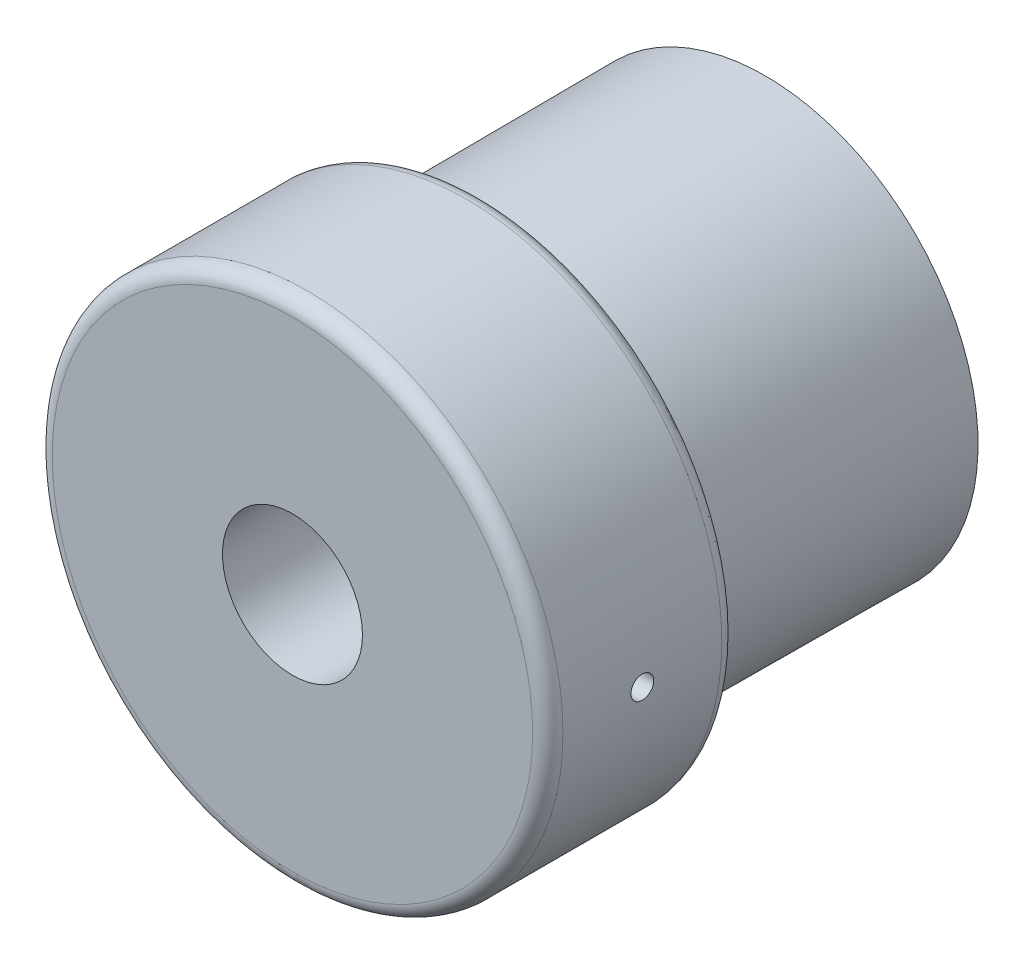
ISO-10303-21;
HEADER;
FILE_DESCRIPTION(('STEP AP214'),'2;1');
FILE_NAME('part.step','',(''),(''),'','','');
FILE_SCHEMA(('AUTOMOTIVE_DESIGN { 1 0 10303 214 1 1 1 1 }'));
ENDSEC;
DATA;
#1=APPLICATION_CONTEXT('core data for automotive mechanical design processes');
#2=APPLICATION_PROTOCOL_DEFINITION('international standard','automotive_design',2000,#1);
#3=PRODUCT_CONTEXT('',#1,'mechanical');
#4=PRODUCT('Part','Part','',(#3));
#5=PRODUCT_RELATED_PRODUCT_CATEGORY('part','',(#4));
#6=PRODUCT_DEFINITION_FORMATION('','',#4);
#7=PRODUCT_DEFINITION_CONTEXT('part definition',#1,'design');
#8=PRODUCT_DEFINITION('design','',#6,#7);
#9=PRODUCT_DEFINITION_SHAPE('','',#8);
#10=(LENGTH_UNIT() NAMED_UNIT(*) SI_UNIT(.MILLI.,.METRE.));
#11=(NAMED_UNIT(*) PLANE_ANGLE_UNIT() SI_UNIT($,.RADIAN.));
#12=(NAMED_UNIT(*) SI_UNIT($,.STERADIAN.) SOLID_ANGLE_UNIT());
#13=UNCERTAINTY_MEASURE_WITH_UNIT(LENGTH_MEASURE(1.E-05),#10,'distance_accuracy_value','');
#14=(GEOMETRIC_REPRESENTATION_CONTEXT(3) GLOBAL_UNCERTAINTY_ASSIGNED_CONTEXT((#13)) GLOBAL_UNIT_ASSIGNED_CONTEXT((#10,
#11,#12)) REPRESENTATION_CONTEXT('',''));
#15=CARTESIAN_POINT('',(0.,0.,0.));
#16=DIRECTION('',(0.,0.,1.));
#17=DIRECTION('',(1.,0.,0.));
#18=AXIS2_PLACEMENT_3D('',#15,#16,#17);
#19=CARTESIAN_POINT('',(0.,0.,-1.));
#20=DIRECTION('',(0.,0.,1.));
#21=DIRECTION('',(1.,0.,0.));
#22=AXIS2_PLACEMENT_3D('',#19,#20,#21);
#23=CYLINDRICAL_SURFACE('',#22,3.7);
#24=CARTESIAN_POINT('',(0.,0.,9.76));
#25=DIRECTION('',(0.,0.,1.));
#26=DIRECTION('',(1.,0.,0.));
#27=AXIS2_PLACEMENT_3D('',#24,#25,#26);
#28=CIRCLE('',#27,3.7);
#29=CARTESIAN_POINT('',(3.7,0.,9.76));
#30=VERTEX_POINT('',#29);
#31=EDGE_CURVE('E117',#30,#30,#28,.T.);
#32=ORIENTED_EDGE('',*,*,#31,.T.);
#33=EDGE_LOOP('',(#32));
#34=FACE_BOUND('',#33,.T.);
#35=CARTESIAN_POINT('',(0.,0.,4.24));
#36=DIRECTION('',(0.,0.,1.));
#37=DIRECTION('',(1.,0.,0.));
#38=AXIS2_PLACEMENT_3D('',#35,#36,#37);
#39=CIRCLE('',#38,3.7);
#40=CARTESIAN_POINT('',(3.7,0.,4.24));
#41=VERTEX_POINT('',#40);
#42=EDGE_CURVE('E20',#41,#41,#39,.F.);
#43=ORIENTED_EDGE('',*,*,#42,.T.);
#44=EDGE_LOOP('',(#43));
#45=FACE_BOUND('',#44,.T.);
#46=ADVANCED_FACE('F17',(#34,#45),#23,.F.);
#47=CARTESIAN_POINT('',(0.,0.,4.));
#48=DIRECTION('',(0.,0.,1.));
#49=DIRECTION('',(1.,0.,0.));
#50=AXIS2_PLACEMENT_3D('',#47,#48,#49);
#51=TOROIDAL_SURFACE('',#50,3.88,0.3);
#52=ORIENTED_EDGE('',*,*,#42,.F.);
#53=EDGE_LOOP('',(#52));
#54=FACE_BOUND('',#53,.T.);
#55=CARTESIAN_POINT('',(0.,0.,3.76));
#56=DIRECTION('',(0.,0.,1.));
#57=DIRECTION('',(1.,0.,0.));
#58=AXIS2_PLACEMENT_3D('',#55,#56,#57);
#59=CIRCLE('',#58,3.7);
#60=CARTESIAN_POINT('',(3.7,0.,3.76));
#61=VERTEX_POINT('',#60);
#62=EDGE_CURVE('E111',#61,#61,#59,.F.);
#63=ORIENTED_EDGE('',*,*,#62,.T.);
#64=EDGE_LOOP('',(#63));
#65=FACE_BOUND('',#64,.T.);
#66=ADVANCED_FACE('F132',(#54,#65),#51,.F.);
#67=CARTESIAN_POINT('',(0.,0.,10.));
#68=DIRECTION('',(0.,0.,1.));
#69=DIRECTION('',(1.,0.,0.));
#70=AXIS2_PLACEMENT_3D('',#67,#68,#69);
#71=TOROIDAL_SURFACE('',#70,3.88,0.3);
#72=ORIENTED_EDGE('',*,*,#31,.F.);
#73=EDGE_LOOP('',(#72));
#74=FACE_BOUND('',#73,.T.);
#75=CARTESIAN_POINT('',(0.,0.,10.24));
#76=DIRECTION('',(0.,0.,1.));
#77=DIRECTION('',(1.,0.,0.));
#78=AXIS2_PLACEMENT_3D('',#75,#76,#77);
#79=CIRCLE('',#78,3.7);
#80=CARTESIAN_POINT('',(3.7,0.,10.24));
#81=VERTEX_POINT('',#80);
#82=EDGE_CURVE('E86',#81,#81,#79,.T.);
#83=ORIENTED_EDGE('',*,*,#82,.T.);
#84=EDGE_LOOP('',(#83));
#85=FACE_BOUND('',#84,.T.);
#86=ADVANCED_FACE('F137',(#74,#85),#71,.F.);
#87=CARTESIAN_POINT('',(0.,0.,-1.));
#88=DIRECTION('',(0.,0.,1.));
#89=DIRECTION('',(1.,0.,0.));
#90=AXIS2_PLACEMENT_3D('',#87,#88,#89);
#91=CYLINDRICAL_SURFACE('',#90,3.7);
#92=CARTESIAN_POINT('',(0.,0.,0.));
#93=DIRECTION('',(0.,0.,1.));
#94=DIRECTION('',(1.,0.,0.));
#95=AXIS2_PLACEMENT_3D('',#92,#93,#94);
#96=CIRCLE('',#95,3.7);
#97=CARTESIAN_POINT('',(3.7,0.,0.));
#98=VERTEX_POINT('',#97);
#99=EDGE_CURVE('E110',#98,#98,#96,.F.);
#100=ORIENTED_EDGE('',*,*,#99,.T.);
#101=EDGE_LOOP('',(#100));
#102=FACE_BOUND('',#101,.T.);
#103=ORIENTED_EDGE('',*,*,#62,.F.);
#104=EDGE_LOOP('',(#103));
#105=FACE_BOUND('',#104,.T.);
#106=ADVANCED_FACE('F136',(#102,#105),#91,.F.);
#107=CARTESIAN_POINT('',(-1.7,-6.3,-0.2));
#108=DIRECTION('',(0.,1.,0.));
#109=DIRECTION('',(1.,0.,0.));
#110=AXIS2_PLACEMENT_3D('',#107,#108,#109);
#111=PLANE('',#110);
#112=DIRECTION('',(0.,0.,1.));
#113=VECTOR('',#112,1.);
#114=CARTESIAN_POINT('',(-1.7,-6.3,-0.2));
#115=LINE('',#114,#113);
#116=CARTESIAN_POINT('',(-1.7,-6.3,0.));
#117=VERTEX_POINT('',#116);
#118=CARTESIAN_POINT('',(-1.7,-6.3,15.3));
#119=VERTEX_POINT('',#118);
#120=EDGE_CURVE('E297',#117,#119,#115,.T.);
#121=ORIENTED_EDGE('',*,*,#120,.F.);
#122=DIRECTION('',(1.,0.,0.));
#123=VECTOR('',#122,1.);
#124=CARTESIAN_POINT('',(-1.7,-6.3,0.));
#125=LINE('',#124,#123);
#126=CARTESIAN_POINT('',(1.7,-6.3,0.));
#127=VERTEX_POINT('',#126);
#128=EDGE_CURVE('E80',#117,#127,#125,.T.);
#129=ORIENTED_EDGE('',*,*,#128,.T.);
#130=DIRECTION('',(0.,0.,-1.));
#131=VECTOR('',#130,1.);
#132=CARTESIAN_POINT('',(1.7,-6.3,-0.2));
#133=LINE('',#132,#131);
#134=CARTESIAN_POINT('',(1.7,-6.3,15.3));
#135=VERTEX_POINT('',#134);
#136=EDGE_CURVE('E101',#127,#135,#133,.F.);
#137=ORIENTED_EDGE('',*,*,#136,.T.);
#138=DIRECTION('',(1.,0.,0.));
#139=VECTOR('',#138,1.);
#140=CARTESIAN_POINT('',(-1.7,-6.3,15.3));
#141=LINE('',#140,#139);
#142=EDGE_CURVE('E278',#135,#119,#141,.F.);
#143=ORIENTED_EDGE('',*,*,#142,.T.);
#144=EDGE_LOOP('',(#121,#129,#137,#143));
#145=FACE_BOUND('',#144,.T.);
#146=ADVANCED_FACE('F143',(#145),#111,.F.);
#147=CARTESIAN_POINT('',(0.,0.,-1.));
#148=DIRECTION('',(0.,0.,1.));
#149=DIRECTION('',(1.,0.,0.));
#150=AXIS2_PLACEMENT_3D('',#147,#148,#149);
#151=CYLINDRICAL_SURFACE('',#150,3.7);
#152=ORIENTED_EDGE('',*,*,#82,.F.);
#153=EDGE_LOOP('',(#152));
#154=FACE_BOUND('',#153,.T.);
#155=CARTESIAN_POINT('',(0.,0.,17.76));
#156=DIRECTION('',(0.,0.,1.));
#157=DIRECTION('',(1.,0.,0.));
#158=AXIS2_PLACEMENT_3D('',#155,#156,#157);
#159=CIRCLE('',#158,3.7);
#160=CARTESIAN_POINT('',(3.7,0.,17.76));
#161=VERTEX_POINT('',#160);
#162=EDGE_CURVE('E262',#161,#161,#159,.T.);
#163=ORIENTED_EDGE('',*,*,#162,.T.);
#164=EDGE_LOOP('',(#163));
#165=FACE_BOUND('',#164,.T.);
#166=ADVANCED_FACE('F149',(#154,#165),#151,.F.);
#167=CARTESIAN_POINT('',(1.7,-11.6,-0.2));
#168=DIRECTION('',(1.,0.,0.));
#169=DIRECTION('',(0.,1.,0.));
#170=AXIS2_PLACEMENT_3D('',#167,#168,#169);
#171=PLANE('',#170);
#172=ORIENTED_EDGE('',*,*,#136,.F.);
#173=DIRECTION('',(0.,1.,0.));
#174=VECTOR('',#173,1.);
#175=CARTESIAN_POINT('',(1.7,-11.6,0.));
#176=LINE('',#175,#174);
#177=CARTESIAN_POINT('',(1.7,-11.1208138191411,0.));
#178=VERTEX_POINT('',#177);
#179=EDGE_CURVE('E310',#127,#178,#176,.F.);
#180=ORIENTED_EDGE('',*,*,#179,.T.);
#181=CARTESIAN_POINT('',(1.7,-11.0499954751122,15.));
#182=CARTESIAN_POINT('',(1.7,-11.0617993987189,12.5000000041214));
#183=CARTESIAN_POINT('',(1.7,-11.0736028891913,10.0000000061978));
#184=CARTESIAN_POINT('',(1.7,-11.0972090038673,5.00000000626089));
#185=CARTESIAN_POINT('',(1.7,-11.109011628071,2.50000000424749));
#186=CARTESIAN_POINT('',(1.7,-11.1208138191402,1.89174994022195E-10));
#187=B_SPLINE_CURVE_WITH_KNOTS('',3,(#181,#182,#183,#184,#185,#186),.UNSPECIFIED.,.F.,.F.,(4,2,
4),(0.,7.50008358673726,15.0001671734745),.UNSPECIFIED.);
#188=CARTESIAN_POINT('',(1.7,-11.0499954751122,15.));
#189=VERTEX_POINT('',#188);
#190=EDGE_CURVE('E98',#189,#178,#187,.T.);
#191=ORIENTED_EDGE('',*,*,#190,.F.);
#192=DIRECTION('',(0.,1.,0.));
#193=VECTOR('',#192,1.);
#194=CARTESIAN_POINT('',(1.7,0.,15.));
#195=LINE('',#194,#193);
#196=CARTESIAN_POINT('',(1.7,-11.6,15.));
#197=VERTEX_POINT('',#196);
#198=EDGE_CURVE('E38',#197,#189,#195,.T.);
#199=ORIENTED_EDGE('',*,*,#198,.F.);
#200=DIRECTION('',(0.,0.,-1.));
#201=VECTOR('',#200,1.);
#202=CARTESIAN_POINT('',(1.7,-11.6,-0.2));
#203=LINE('',#202,#201);
#204=CARTESIAN_POINT('',(1.7,-11.6,15.3));
#205=VERTEX_POINT('',#204);
#206=EDGE_CURVE('E49',#205,#197,#203,.T.);
#207=ORIENTED_EDGE('',*,*,#206,.F.);
#208=DIRECTION('',(0.,1.,0.));
#209=VECTOR('',#208,1.);
#210=CARTESIAN_POINT('',(1.7,-11.6,15.3));
#211=LINE('',#210,#209);
#212=EDGE_CURVE('E287',#205,#135,#211,.T.);
#213=ORIENTED_EDGE('',*,*,#212,.T.);
#214=EDGE_LOOP('',(#172,#180,#191,#199,#207,#213));
#215=FACE_BOUND('',#214,.T.);
#216=ADVANCED_FACE('F96',(#215),#171,.F.);
#217=CARTESIAN_POINT('',(0.,0.,0.));
#218=DIRECTION('',(0.,0.,1.));
#219=DIRECTION('',(1.,0.,0.));
#220=AXIS2_PLACEMENT_3D('',#217,#218,#219);
#221=PLANE('',#220);
#222=ORIENTED_EDGE('',*,*,#128,.F.);
#223=DIRECTION('',(0.,1.,0.));
#224=VECTOR('',#223,1.);
#225=CARTESIAN_POINT('',(-1.7,-11.6,0.));
#226=LINE('',#225,#224);
#227=CARTESIAN_POINT('',(-1.7,-11.1208138191407,9.45874792816306E-11));
#228=VERTEX_POINT('',#227);
#229=EDGE_CURVE('E61',#228,#117,#226,.T.);
#230=ORIENTED_EDGE('',*,*,#229,.F.);
#231=CARTESIAN_POINT('',(0.,0.,0.));
#232=DIRECTION('',(0.,0.,-1.));
#233=DIRECTION('',(-1.,0.,0.));
#234=AXIS2_PLACEMENT_3D('',#231,#232,#233);
#235=CIRCLE('',#234,11.25);
#236=EDGE_CURVE('E263',#178,#228,#235,.F.);
#237=ORIENTED_EDGE('',*,*,#236,.F.);
#238=ORIENTED_EDGE('',*,*,#179,.F.);
#239=EDGE_LOOP('',(#222,#230,#237,#238));
#240=FACE_BOUND('',#239,.T.);
#241=ORIENTED_EDGE('',*,*,#99,.F.);
#242=EDGE_LOOP('',(#241));
#243=FACE_BOUND('',#242,.T.);
#244=ADVANCED_FACE('F269',(#240,#243),#221,.F.);
#245=CARTESIAN_POINT('',(-1.7,-11.6,-0.2));
#246=DIRECTION('',(1.,0.,0.));
#247=DIRECTION('',(0.,1.,0.));
#248=AXIS2_PLACEMENT_3D('',#245,#246,#247);
#249=PLANE('',#248);
#250=ORIENTED_EDGE('',*,*,#120,.T.);
#251=DIRECTION('',(0.,1.,0.));
#252=VECTOR('',#251,1.);
#253=CARTESIAN_POINT('',(-1.7,-11.6,15.3));
#254=LINE('',#253,#252);
#255=CARTESIAN_POINT('',(-1.7,-11.6,15.3));
#256=VERTEX_POINT('',#255);
#257=EDGE_CURVE('E291',#119,#256,#254,.F.);
#258=ORIENTED_EDGE('',*,*,#257,.T.);
#259=DIRECTION('',(0.,0.,1.));
#260=VECTOR('',#259,1.);
#261=CARTESIAN_POINT('',(-1.7,-11.6,-0.2));
#262=LINE('',#261,#260);
#263=CARTESIAN_POINT('',(-1.7,-11.6,15.));
#264=VERTEX_POINT('',#263);
#265=EDGE_CURVE('E308',#256,#264,#262,.F.);
#266=ORIENTED_EDGE('',*,*,#265,.T.);
#267=DIRECTION('',(0.,1.,0.));
#268=VECTOR('',#267,1.);
#269=CARTESIAN_POINT('',(-1.7,-11.6,15.));
#270=LINE('',#269,#268);
#271=CARTESIAN_POINT('',(-1.7,-11.0499954751122,15.));
#272=VERTEX_POINT('',#271);
#273=EDGE_CURVE('E93',#264,#272,#270,.T.);
#274=ORIENTED_EDGE('',*,*,#273,.T.);
#275=CARTESIAN_POINT('',(-1.7,-11.1208138191402,1.89174963978169E-10));
#276=CARTESIAN_POINT('',(-1.7,-11.109011628071,2.50000000424749));
#277=CARTESIAN_POINT('',(-1.7,-11.0972090038673,5.00000000626089));
#278=CARTESIAN_POINT('',(-1.7,-11.0736028891913,10.0000000061978));
#279=CARTESIAN_POINT('',(-1.7,-11.0617993987189,12.5000000041214));
#280=CARTESIAN_POINT('',(-1.7,-11.0499954751122,15.));
#281=B_SPLINE_CURVE_WITH_KNOTS('',3,(#275,#276,#277,#278,#279,#280),.UNSPECIFIED.,.F.,.F.,(4,2,
4),(0.,7.50008358673726,15.0001671734745),.UNSPECIFIED.);
#282=EDGE_CURVE('E249',#228,#272,#281,.T.);
#283=ORIENTED_EDGE('',*,*,#282,.F.);
#284=ORIENTED_EDGE('',*,*,#229,.T.);
#285=EDGE_LOOP('',(#250,#258,#266,#274,#283,#284));
#286=FACE_BOUND('',#285,.T.);
#287=ADVANCED_FACE('F319',(#286),#249,.T.);
#288=CARTESIAN_POINT('',(-1.7,-11.6,15.3));
#289=DIRECTION('',(0.,0.,1.));
#290=DIRECTION('',(1.,0.,0.));
#291=AXIS2_PLACEMENT_3D('',#288,#289,#290);
#292=PLANE('',#291);
#293=ORIENTED_EDGE('',*,*,#212,.F.);
#294=DIRECTION('',(1.,0.,0.));
#295=VECTOR('',#294,1.);
#296=CARTESIAN_POINT('',(-1.7,-11.6,15.3));
#297=LINE('',#296,#295);
#298=EDGE_CURVE('E88',#256,#205,#297,.T.);
#299=ORIENTED_EDGE('',*,*,#298,.F.);
#300=ORIENTED_EDGE('',*,*,#257,.F.);
#301=ORIENTED_EDGE('',*,*,#142,.F.);
#302=EDGE_LOOP('',(#293,#299,#300,#301));
#303=FACE_BOUND('',#302,.T.);
#304=ADVANCED_FACE('F242',(#303),#292,.F.);
#305=CARTESIAN_POINT('',(0.,0.,0.));
#306=DIRECTION('',(0.,0.,-1.));
#307=DIRECTION('',(1.,0.,0.));
#308=AXIS2_PLACEMENT_3D('',#305,#306,#307);
#309=CONICAL_SURFACE('',#308,11.25,0.00466663279056701);
#310=ORIENTED_EDGE('',*,*,#236,.T.);
#311=ORIENTED_EDGE('',*,*,#282,.T.);
#312=CARTESIAN_POINT('',(0.,0.,15.));
#313=DIRECTION('',(0.,0.,-1.));
#314=DIRECTION('',(-1.,0.,0.));
#315=AXIS2_PLACEMENT_3D('',#312,#313,#314);
#316=CIRCLE('',#315,11.18);
#317=EDGE_CURVE('E94',#272,#189,#316,.T.);
#318=ORIENTED_EDGE('',*,*,#317,.T.);
#319=ORIENTED_EDGE('',*,*,#190,.T.);
#320=EDGE_LOOP('',(#310,#311,#318,#319));
#321=FACE_BOUND('',#320,.T.);
#322=ADVANCED_FACE('F237',(#321),#309,.T.);
#323=CARTESIAN_POINT('',(-1.7,-11.6,-0.2));
#324=DIRECTION('',(0.,1.,0.));
#325=DIRECTION('',(1.,0.,0.));
#326=AXIS2_PLACEMENT_3D('',#323,#324,#325);
#327=PLANE('',#326);
#328=ORIENTED_EDGE('',*,*,#265,.F.);
#329=ORIENTED_EDGE('',*,*,#298,.T.);
#330=ORIENTED_EDGE('',*,*,#206,.T.);
#331=DIRECTION('',(1.,0.,0.));
#332=VECTOR('',#331,1.);
#333=CARTESIAN_POINT('',(-1.7,-11.6,15.));
#334=LINE('',#333,#332);
#335=EDGE_CURVE('E84',#197,#264,#334,.F.);
#336=ORIENTED_EDGE('',*,*,#335,.T.);
#337=EDGE_LOOP('',(#328,#329,#330,#336));
#338=FACE_BOUND('',#337,.T.);
#339=ADVANCED_FACE('F85',(#338),#327,.T.);
#340=CARTESIAN_POINT('',(0.,0.,18.));
#341=DIRECTION('',(0.,0.,1.));
#342=DIRECTION('',(1.,0.,0.));
#343=AXIS2_PLACEMENT_3D('',#340,#341,#342);
#344=TOROIDAL_SURFACE('',#343,3.88,0.3);
#345=ORIENTED_EDGE('',*,*,#162,.F.);
#346=EDGE_LOOP('',(#345));
#347=FACE_BOUND('',#346,.T.);
#348=CARTESIAN_POINT('',(0.,0.,18.24));
#349=DIRECTION('',(0.,0.,1.));
#350=DIRECTION('',(1.,0.,0.));
#351=AXIS2_PLACEMENT_3D('',#348,#349,#350);
#352=CIRCLE('',#351,3.7);
#353=CARTESIAN_POINT('',(3.7,0.,18.24));
#354=VERTEX_POINT('',#353);
#355=EDGE_CURVE('E91',#354,#354,#352,.T.);
#356=ORIENTED_EDGE('',*,*,#355,.T.);
#357=EDGE_LOOP('',(#356));
#358=FACE_BOUND('',#357,.T.);
#359=ADVANCED_FACE('F235',(#347,#358),#344,.F.);
#360=CARTESIAN_POINT('',(0.,0.,15.));
#361=DIRECTION('',(0.,0.,1.));
#362=DIRECTION('',(1.,0.,0.));
#363=AXIS2_PLACEMENT_3D('',#360,#361,#362);
#364=PLANE('',#363);
#365=CARTESIAN_POINT('',(0.,0.,15.));
#366=DIRECTION('',(0.,0.,-1.));
#367=DIRECTION('',(-1.,0.,0.));
#368=AXIS2_PLACEMENT_3D('',#365,#366,#367);
#369=CIRCLE('',#368,12.7);
#370=CARTESIAN_POINT('',(-12.7,0.,15.));
#371=VERTEX_POINT('',#370);
#372=EDGE_CURVE('E593',#371,#371,#369,.F.);
#373=ORIENTED_EDGE('',*,*,#372,.F.);
#374=EDGE_LOOP('',(#373));
#375=FACE_BOUND('',#374,.T.);
#376=ORIENTED_EDGE('',*,*,#198,.T.);
#377=ORIENTED_EDGE('',*,*,#317,.F.);
#378=ORIENTED_EDGE('',*,*,#273,.F.);
#379=ORIENTED_EDGE('',*,*,#335,.F.);
#380=EDGE_LOOP('',(#376,#377,#378,#379));
#381=FACE_BOUND('',#380,.T.);
#382=ADVANCED_FACE('F89',(#375,#381),#364,.F.);
#383=CARTESIAN_POINT('',(0.,0.,25.));
#384=DIRECTION('',(0.,0.,1.));
#385=DIRECTION('',(1.,0.,0.));
#386=AXIS2_PLACEMENT_3D('',#383,#384,#385);
#387=PLANE('',#386);
#388=CARTESIAN_POINT('',(0.,0.,25.));
#389=DIRECTION('',(0.,0.,1.));
#390=DIRECTION('',(1.,0.,0.));
#391=AXIS2_PLACEMENT_3D('',#388,#389,#390);
#392=CIRCLE('',#391,3.7);
#393=CARTESIAN_POINT('',(3.7,0.,25.));
#394=VERTEX_POINT('',#393);
#395=EDGE_CURVE('E586',#394,#394,#392,.F.);
#396=ORIENTED_EDGE('',*,*,#395,.T.);
#397=EDGE_LOOP('',(#396));
#398=FACE_BOUND('',#397,.T.);
#399=CARTESIAN_POINT('',(0.,0.,25.));
#400=DIRECTION('',(0.,0.,1.));
#401=DIRECTION('',(1.,0.,0.));
#402=AXIS2_PLACEMENT_3D('',#399,#400,#401);
#403=CIRCLE('',#402,12.7);
#404=CARTESIAN_POINT('',(12.7,0.,25.));
#405=VERTEX_POINT('',#404);
#406=EDGE_CURVE('E612',#405,#405,#403,.F.);
#407=ORIENTED_EDGE('',*,*,#406,.F.);
#408=EDGE_LOOP('',(#407));
#409=FACE_BOUND('',#408,.T.);
#410=ADVANCED_FACE('F224',(#398,#409),#387,.T.);
#411=CARTESIAN_POINT('',(0.,0.,-1.));
#412=DIRECTION('',(0.,0.,1.));
#413=DIRECTION('',(1.,0.,0.));
#414=AXIS2_PLACEMENT_3D('',#411,#412,#413);
#415=CYLINDRICAL_SURFACE('',#414,3.7);
#416=ORIENTED_EDGE('',*,*,#355,.F.);
#417=EDGE_LOOP('',(#416));
#418=FACE_BOUND('',#417,.T.);
#419=ORIENTED_EDGE('',*,*,#395,.F.);
#420=EDGE_LOOP('',(#419));
#421=FACE_BOUND('',#420,.T.);
#422=CARTESIAN_POINT('',(3.7,0.,20.6));
#423=CARTESIAN_POINT('',(3.69999909450288,-0.033445060148049,20.5999974525352));
#424=CARTESIAN_POINT('',(3.69954161746064,-0.0669145367677019,20.5971932586284));
#425=CARTESIAN_POINT('',(3.69775884342302,-0.132950189167385,20.5860455602825));
#426=CARTESIAN_POINT('',(3.69643177977255,-0.16551438508098,20.5776907787704));
#427=CARTESIAN_POINT('',(3.69305909738678,-0.2287248541701,20.5557003386781));
#428=CARTESIAN_POINT('',(3.69101435814417,-0.259373420984903,20.5420711416685));
#429=CARTESIAN_POINT('',(3.68643190517326,-0.317936401310021,20.5099333112605));
#430=CARTESIAN_POINT('',(3.68389437780055,-0.345851842411021,20.4914265214587));
#431=CARTESIAN_POINT('',(3.67858150581539,-0.398425610931157,20.4498763767608));
#432=CARTESIAN_POINT('',(3.67580437769202,-0.423055276592201,20.4267969794025));
#433=CARTESIAN_POINT('',(3.67033893457727,-0.468111619703647,20.3768332608034));
#434=CARTESIAN_POINT('',(3.66765062964849,-0.488537822314003,20.3499485102728));
#435=CARTESIAN_POINT('',(3.66265036800973,-0.524717974179859,20.2929455145495));
#436=CARTESIAN_POINT('',(3.66034067933903,-0.54044420005072,20.2628094568849));
#437=CARTESIAN_POINT('',(3.65638344532927,-0.566600552782139,20.2002800757686));
#438=CARTESIAN_POINT('',(3.65473585197158,-0.577031063730102,20.1678869162139));
#439=CARTESIAN_POINT('',(3.65230679786242,-0.592211300985876,20.1020619312151));
#440=CARTESIAN_POINT('',(3.65151791005399,-0.597009768390191,20.0686416254125));
#441=CARTESIAN_POINT('',(3.65087309966081,-0.600940791718987,20.0014615524985));
#442=CARTESIAN_POINT('',(3.6510171161114,-0.600073717882625,19.967701807713));
#443=CARTESIAN_POINT('',(3.65221505605258,-0.592738023579386,19.9011484536845));
#444=CARTESIAN_POINT('',(3.65326009847571,-0.586324074661017,19.8683486353285));
#445=CARTESIAN_POINT('',(3.65612846019332,-0.568162347900166,19.8042966638786));
#446=CARTESIAN_POINT('',(3.65795181131666,-0.5564143519211,19.7730445741373));
#447=CARTESIAN_POINT('',(3.6621810689369,-0.527861724601939,19.7128101021045));
#448=CARTESIAN_POINT('',(3.66458961444847,-0.51103410020101,19.6838388120086));
#449=CARTESIAN_POINT('',(3.66971578269889,-0.472817688863713,19.6291126764916));
#450=CARTESIAN_POINT('',(3.67243340508448,-0.451428907140614,19.6033578273944));
#451=CARTESIAN_POINT('',(3.67791026685536,-0.40440282278917,19.5554809530238));
#452=CARTESIAN_POINT('',(3.68066962468306,-0.37871935704883,19.5334042618436));
#453=CARTESIAN_POINT('',(3.68589130634718,-0.323975490093671,19.4938573602666));
#454=CARTESIAN_POINT('',(3.68835349666277,-0.294913582333494,19.4763892163945));
#455=CARTESIAN_POINT('',(3.69270704250568,-0.234185008279651,19.4465524352644));
#456=CARTESIAN_POINT('',(3.69459749757085,-0.20251433204607,19.4341918310971));
#457=CARTESIAN_POINT('',(3.69758410278062,-0.137560966100073,19.4150046217677));
#458=CARTESIAN_POINT('',(3.69868192773425,-0.104281834817834,19.4081663444103));
#459=CARTESIAN_POINT('',(3.69977354263685,-0.0472293310736795,19.401393853725));
#460=CARTESIAN_POINT('',(3.70000063951225,-0.0236207549647749,19.3999982008392));
#461=CARTESIAN_POINT('',(3.69999909450288,0.0334450601480488,19.4000025474648));
#462=CARTESIAN_POINT('',(3.69954161746064,0.0669145367677018,19.4028067413716));
#463=CARTESIAN_POINT('',(3.69775884342302,0.132950189167385,19.4139544397175));
#464=CARTESIAN_POINT('',(3.69643177977255,0.165514385080979,19.4223092212296));
#465=CARTESIAN_POINT('',(3.69305909738678,0.228724854170098,19.4442996613219));
#466=CARTESIAN_POINT('',(3.69101435814417,0.259373420984902,19.4579288583315));
#467=CARTESIAN_POINT('',(3.68643190517326,0.317936401310019,19.4900666887395));
#468=CARTESIAN_POINT('',(3.68389437780055,0.345851842411019,19.5085734785413));
#469=CARTESIAN_POINT('',(3.67858150581539,0.398425610931156,19.5501236232392));
#470=CARTESIAN_POINT('',(3.67580437769202,0.423055276592199,19.5732030205975));
#471=CARTESIAN_POINT('',(3.67033893457727,0.468111619703646,19.6231667391966));
#472=CARTESIAN_POINT('',(3.66765062964849,0.488537822314002,19.6500514897272));
#473=CARTESIAN_POINT('',(3.66265036800973,0.524717974179859,19.7070544854505));
#474=CARTESIAN_POINT('',(3.66034067933903,0.54044420005072,19.7371905431151));
#475=CARTESIAN_POINT('',(3.65638344532927,0.566600552782138,19.7997199242314));
#476=CARTESIAN_POINT('',(3.65473585197158,0.577031063730102,19.8321130837861));
#477=CARTESIAN_POINT('',(3.65230679786242,0.592211300985876,19.8979380687849));
#478=CARTESIAN_POINT('',(3.65151791005399,0.597009768390191,19.9313583745875));
#479=CARTESIAN_POINT('',(3.65087309966081,0.600940791718987,19.9985384475015));
#480=CARTESIAN_POINT('',(3.6510171161114,0.600073717882625,20.032298192287));
#481=CARTESIAN_POINT('',(3.65221505605258,0.592738023579386,20.0988515463155));
#482=CARTESIAN_POINT('',(3.65326009847571,0.586324074661016,20.1316513646715));
#483=CARTESIAN_POINT('',(3.65612846019332,0.568162347900165,20.1957033361214));
#484=CARTESIAN_POINT('',(3.65795181131666,0.5564143519211,20.2269554258627));
#485=CARTESIAN_POINT('',(3.6621810689369,0.527861724601939,20.2871898978955));
#486=CARTESIAN_POINT('',(3.66458961444847,0.51103410020101,20.3161611879915));
#487=CARTESIAN_POINT('',(3.66971578269889,0.472817688863712,20.3708873235084));
#488=CARTESIAN_POINT('',(3.67243340508448,0.451428907140614,20.3966421726056));
#489=CARTESIAN_POINT('',(3.67791026685536,0.40440282278917,20.4445190469762));
#490=CARTESIAN_POINT('',(3.68066962468306,0.378719357048829,20.4665957381564));
#491=CARTESIAN_POINT('',(3.68589130634718,0.32397549009367,20.5061426397334));
#492=CARTESIAN_POINT('',(3.68835349666277,0.294913582333494,20.5236107836055));
#493=CARTESIAN_POINT('',(3.69270704250568,0.234185008279653,20.5534475647356));
#494=CARTESIAN_POINT('',(3.69459749757085,0.202514332046072,20.5658081689029));
#495=CARTESIAN_POINT('',(3.69758410278062,0.137560966100074,20.5849953782323));
#496=CARTESIAN_POINT('',(3.69868192773425,0.104281834817836,20.5918336555897));
#497=CARTESIAN_POINT('',(3.69977354263685,0.0472293310736804,20.598606146275));
#498=CARTESIAN_POINT('',(3.70000063951225,0.0236207549647751,20.6000017991608));
#499=CARTESIAN_POINT('',(3.7,0.,20.6));
#500=B_SPLINE_CURVE_WITH_KNOTS('',3,(#422,#423,#424,#425,#426,#427,#428,#429,#430,#431,#432,
#433,#434,#435,#436,#437,#438,#439,#440,#441,#442,#443,#444,#445,#446,#447,#448,#449,#450,#451,
#452,#453,#454,#455,#456,#457,#458,#459,#460,#461,#462,#463,#464,#465,#466,#467,#468,#469,#470,
#471,#472,#473,#474,#475,#476,#477,#478,#479,#480,#481,#482,#483,#484,#485,#486,#487,#488,#489,
#490,#491,#492,#493,#494,#495,#496,#497,#498,#499),.UNSPECIFIED.,.T.,.F.,(4,2,2,2,2,2,2,2,2,2,2,
2,2,2,2,2,2,2,2,2,2,2,2,2,2,2,2,2,2,2,2,2,2,2,2,2,2,2,4),(0.,0.10025826428223,0.200720847745133,
0.301060744335203,0.401362769445742,0.502489333397319,0.603627314747924,0.70535060207358,
0.807066510562296,0.907895497508184,1.00871789541621,1.10855774074599,1.20840166940769,
1.30870449933089,1.40900721461148,1.51046698405447,1.61197217217249,1.71363640456435,
1.81508518907091,1.88589313150907,1.9861513957913,2.08661397925421,2.18695387584427,
2.28725590095482,2.38838246490639,2.489520446257,2.59124373358265,2.69295964207137,
2.79378862901726,2.89461102692528,2.99445087225506,3.09429480091677,3.19459763083997,
3.29490034612055,3.39636011556355,3.49786530368156,3.59952953607343,3.70097832057998,
3.77178626301815),.UNSPECIFIED.);
#501=CARTESIAN_POINT('',(3.7,0.,20.6));
#502=VERTEX_POINT('',#501);
#503=EDGE_CURVE('E206',#502,#502,#500,.T.);
#504=ORIENTED_EDGE('',*,*,#503,.T.);
#505=EDGE_LOOP('',(#504));
#506=FACE_BOUND('',#505,.T.);
#507=CARTESIAN_POINT('',(-3.7,0.,19.4));
#508=CARTESIAN_POINT('',(-3.69999943573637,-0.033466933021308,19.4000013531763));
#509=CARTESIAN_POINT('',(-3.69954119367091,-0.0669524551592885,19.4028095463597));
#510=CARTESIAN_POINT('',(-3.69775729479225,-0.132985229889856,19.4139639642987));
#511=CARTESIAN_POINT('',(-3.69643082718486,-0.165531575739397,19.4223153656934));
#512=CARTESIAN_POINT('',(-3.69305933786693,-0.22872100922857,19.4442981598624));
#513=CARTESIAN_POINT('',(-3.69101489159581,-0.259365597995745,19.4579253251555));
#514=CARTESIAN_POINT('',(-3.68643255059057,-0.317929159913094,19.4900619551308));
#515=CARTESIAN_POINT('',(-3.68389471567367,-0.345848462854502,19.5085708280638));
#516=CARTESIAN_POINT('',(-3.67858143852364,-0.398426313230469,19.5501241576586));
#517=CARTESIAN_POINT('',(-3.67580423479059,-0.423056552716012,19.573204211226));
#518=CARTESIAN_POINT('',(-3.67033879544494,-0.468112668213745,19.6231681264341));
#519=CARTESIAN_POINT('',(-3.66765056531301,-0.488538285629447,19.650052221863));
#520=CARTESIAN_POINT('',(-3.66265037913206,-0.524717895908914,19.7070543599521));
#521=CARTESIAN_POINT('',(-3.6603406994491,-0.540444063535788,19.73719028054));
#522=CARTESIAN_POINT('',(-3.65638345965871,-0.566600461762879,19.7997196428761));
#523=CARTESIAN_POINT('',(-3.65473585727008,-0.577031030558771,19.8321129403098));
#524=CARTESIAN_POINT('',(-3.65230679684427,-0.592211307406906,19.8979380962689));
#525=CARTESIAN_POINT('',(-3.65151790874174,-0.597009776301814,19.9313584304901));
#526=CARTESIAN_POINT('',(-3.65087309988264,-0.600940790374767,19.9985385038211));
#527=CARTESIAN_POINT('',(-3.65101711660873,-0.600073715221432,20.0322982200362));
#528=CARTESIAN_POINT('',(-3.65221505852173,-0.592738008078806,20.0988516833747));
#529=CARTESIAN_POINT('',(-3.6532601071183,-0.586324020092256,20.1316516364755));
#530=CARTESIAN_POINT('',(-3.6561284753913,-0.568162251677083,20.1957035961137));
#531=CARTESIAN_POINT('',(-3.65795182045791,-0.556414297238915,20.226955552114));
#532=CARTESIAN_POINT('',(-3.66218098622461,-0.527862275945968,20.2871887238393));
#533=CARTESIAN_POINT('',(-3.66458942585467,-0.511035390897521,20.3161589317379));
#534=CARTESIAN_POINT('',(-3.66971557172598,-0.47281937634711,20.3708853150158));
#535=CARTESIAN_POINT('',(-3.6724333016176,-0.451429897849473,20.3966412442939));
#536=CARTESIAN_POINT('',(-3.67791087300813,-0.404397514659573,20.4445243698775));
#537=CARTESIAN_POINT('',(-3.68067083475632,-0.378707698579462,20.4666055004771));
#538=CARTESIAN_POINT('',(-3.6858924112886,-0.323962880293662,20.5061504080562));
#539=CARTESIAN_POINT('',(-3.68835402433564,-0.294907858496809,20.5236141581528));
#540=CARTESIAN_POINT('',(-3.69270477286464,-0.234215029961779,20.5534322518929));
#541=CARTESIAN_POINT('',(-3.69459346828939,-0.202575261439971,20.5657826706371));
#542=CARTESIAN_POINT('',(-3.69758200582559,-0.137633145606058,20.5849815275411));
#543=CARTESIAN_POINT('',(-3.69868191036799,-0.104330930095986,20.5918304011406));
#544=CARTESIAN_POINT('',(-3.69996057731234,-0.0374064409773847,20.5997696402351));
#545=CARTESIAN_POINT('',(-3.70014945907138,-0.00379185889479405,20.6009232701266));
#546=CARTESIAN_POINT('',(-3.69961246700891,0.0631504078785804,20.5976077318369));
#547=CARTESIAN_POINT('',(-3.69888662644593,0.0964781029559723,20.5931387680883));
#548=CARTESIAN_POINT('',(-3.69660800849107,0.161706192903584,20.5787575175028));
#549=CARTESIAN_POINT('',(-3.69505996961785,0.193613642318903,20.5688764119887));
#550=CARTESIAN_POINT('',(-3.69130987105477,0.255319066568922,20.5439845060543));
#551=CARTESIAN_POINT('',(-3.68910777628159,0.285116928139862,20.5289734304578));
#552=CARTESIAN_POINT('',(-3.6842688550562,0.342033075698817,20.4941018116127));
#553=CARTESIAN_POINT('',(-3.68162853102023,0.369126740979839,20.474201577945));
#554=CARTESIAN_POINT('',(-3.67621696472163,0.419612545096453,20.4301713200455));
#555=CARTESIAN_POINT('',(-3.67344571349643,0.443004430049944,20.4060410059379));
#556=CARTESIAN_POINT('',(-3.66805208554494,0.485655967886319,20.3539523954049));
#557=CARTESIAN_POINT('',(-3.66543142994239,0.504872968665041,20.3259589682575));
#558=CARTESIAN_POINT('',(-3.66066738930098,0.538331753225499,20.2671041887776));
#559=CARTESIAN_POINT('',(-3.65852398973117,0.552573688490009,20.2362429238024));
#560=CARTESIAN_POINT('',(-3.6549699348168,0.575613623170265,20.1726499825603));
#561=CARTESIAN_POINT('',(-3.65355637983617,0.584433192457537,20.1399262904585));
#562=CARTESIAN_POINT('',(-3.65161466500305,0.5964461444813,20.0734372294421));
#563=CARTESIAN_POINT('',(-3.65108643266552,0.599639987820462,20.0396719460375));
#564=CARTESIAN_POINT('',(-3.65097818022615,0.600298507477983,19.972483856329));
#565=CARTESIAN_POINT('',(-3.65138705224938,0.597830298072029,19.9390617066441));
#566=CARTESIAN_POINT('',(-3.6530826516825,0.587379534233159,19.8731148299452));
#567=CARTESIAN_POINT('',(-3.65436937667482,0.579396994986477,19.8405901004599));
#568=CARTESIAN_POINT('',(-3.65767157344305,0.55816933091902,19.7773852208895));
#569=CARTESIAN_POINT('',(-3.65968628683646,0.544929681282773,19.7467031898214));
#570=CARTESIAN_POINT('',(-3.6642182371672,0.513570448459691,19.6879849711468));
#571=CARTESIAN_POINT('',(-3.66673549683641,0.495450644513873,19.6599489033108));
#572=CARTESIAN_POINT('',(-3.67202426492506,0.454604714704107,19.6069788259584));
#573=CARTESIAN_POINT('',(-3.67479831242855,0.431829116746159,19.5820832133641));
#574=CARTESIAN_POINT('',(-3.68026757647199,0.382422545421924,19.5364440243398));
#575=CARTESIAN_POINT('',(-3.68296277464045,0.355790682031149,19.5157014090605));
#576=CARTESIAN_POINT('',(-3.68799090596516,0.299222190390235,19.4788344252364));
#577=CARTESIAN_POINT('',(-3.69032136887616,0.269265194074615,19.4627409719769));
#578=CARTESIAN_POINT('',(-3.69433337752362,0.207048027120908,19.4358391630905));
#579=CARTESIAN_POINT('',(-3.69601557644957,0.174790213836725,19.4250254846238));
#580=CARTESIAN_POINT('',(-3.69816966571432,0.11866789084061,19.4113671886238));
#581=CARTESIAN_POINT('',(-3.69885241287302,0.0951449155425877,19.4071112313269));
#582=CARTESIAN_POINT('',(-3.6997677777777,0.0477511113922729,19.4014271765573));
#583=CARTESIAN_POINT('',(-3.7000004026296,0.0238802880373428,19.3999990344427));
#584=CARTESIAN_POINT('',(-3.7,0.,19.4));
#585=B_SPLINE_CURVE_WITH_KNOTS('',3,(#507,#508,#509,#510,#511,#512,#513,#514,#515,#516,#517,
#518,#519,#520,#521,#522,#523,#524,#525,#526,#527,#528,#529,#530,#531,#532,#533,#534,#535,#536,
#537,#538,#539,#540,#541,#542,#543,#544,#545,#546,#547,#548,#549,#550,#551,#552,#553,#554,#555,
#556,#557,#558,#559,#560,#561,#562,#563,#564,#565,#566,#567,#568,#569,#570,#571,#572,#573,#574,
#575,#576,#577,#578,#579,#580,#581,#582,#583,#584),.UNSPECIFIED.,.T.,.F.,(4,2,2,2,2,2,2,2,2,2,2,
2,2,2,2,2,2,2,2,2,2,2,2,2,2,2,2,2,2,2,2,2,2,2,2,2,2,2,4),(0.,0.100313517699249,
0.200720847293474,0.301047886244957,0.401362769369358,0.502491933088648,0.603627314688637,
0.705350161187874,0.807066510488846,0.907895581342083,1.00871789534353,1.10855815367619,
1.20840166932338,1.30870060462157,1.40900721460194,1.51048939819858,1.61197217262211,
1.71353269958586,1.81508518738185,1.91550702248541,2.01592520644201,2.11577083888613,
2.21562182798265,2.31631187103695,2.4170088168053,2.51869061113273,2.62036930914249,
2.72164087268593,2.82290414430015,2.92297331858927,3.02304221729315,3.12300716827995,
3.22297664204763,3.32406944530202,3.4251856180344,3.52695946595219,3.62863049693554,
3.70021021155519,3.77178879615905),.UNSPECIFIED.);
#586=CARTESIAN_POINT('',(-3.7,0.,19.4));
#587=VERTEX_POINT('',#586);
#588=EDGE_CURVE('E198',#587,#587,#585,.T.);
#589=ORIENTED_EDGE('',*,*,#588,.T.);
#590=EDGE_LOOP('',(#589));
#591=FACE_BOUND('',#590,.T.);
#592=ADVANCED_FACE('F220',(#418,#421,#506,#591),#415,.F.);
#593=CARTESIAN_POINT('',(0.,0.,15.8));
#594=DIRECTION('',(0.,0.,-1.));
#595=DIRECTION('',(1.,0.,0.));
#596=AXIS2_PLACEMENT_3D('',#593,#594,#595);
#597=TOROIDAL_SURFACE('',#596,12.7,0.8);
#598=CARTESIAN_POINT('',(0.,0.,15.8));
#599=DIRECTION('',(0.,0.,1.));
#600=DIRECTION('',(1.,0.,0.));
#601=AXIS2_PLACEMENT_3D('',#598,#599,#600);
#602=CIRCLE('',#601,13.5);
#603=CARTESIAN_POINT('',(13.5,0.,15.8));
#604=VERTEX_POINT('',#603);
#605=EDGE_CURVE('E188',#604,#604,#602,.T.);
#606=ORIENTED_EDGE('',*,*,#605,.F.);
#607=EDGE_LOOP('',(#606));
#608=FACE_BOUND('',#607,.T.);
#609=ORIENTED_EDGE('',*,*,#372,.T.);
#610=EDGE_LOOP('',(#609));
#611=FACE_BOUND('',#610,.T.);
#612=ADVANCED_FACE('F225',(#608,#611),#597,.T.);
#613=CARTESIAN_POINT('',(0.,0.,24.2));
#614=DIRECTION('',(0.,0.,1.));
#615=DIRECTION('',(1.,0.,0.));
#616=AXIS2_PLACEMENT_3D('',#613,#614,#615);
#617=TOROIDAL_SURFACE('',#616,12.7,0.8);
#618=CARTESIAN_POINT('',(0.,0.,24.2));
#619=DIRECTION('',(0.,0.,1.));
#620=DIRECTION('',(1.,0.,0.));
#621=AXIS2_PLACEMENT_3D('',#618,#619,#620);
#622=CIRCLE('',#621,13.5);
#623=CARTESIAN_POINT('',(13.5,0.,24.2));
#624=VERTEX_POINT('',#623);
#625=EDGE_CURVE('E30',#624,#624,#622,.F.);
#626=ORIENTED_EDGE('',*,*,#625,.F.);
#627=EDGE_LOOP('',(#626));
#628=FACE_BOUND('',#627,.T.);
#629=ORIENTED_EDGE('',*,*,#406,.T.);
#630=EDGE_LOOP('',(#629));
#631=FACE_BOUND('',#630,.T.);
#632=ADVANCED_FACE('F469',(#628,#631),#617,.T.);
#633=CARTESIAN_POINT('',(-15.,0.,20.));
#634=DIRECTION('',(1.,0.,0.));
#635=DIRECTION('',(0.,0.,-1.));
#636=AXIS2_PLACEMENT_3D('',#633,#634,#635);
#637=CYLINDRICAL_SURFACE('',#636,0.6);
#638=ORIENTED_EDGE('',*,*,#503,.F.);
#639=EDGE_LOOP('',(#638));
#640=FACE_BOUND('',#639,.T.);
#641=CARTESIAN_POINT('',(13.5,0.,19.4));
#642=CARTESIAN_POINT('',(13.4999997168411,-0.033664824888769,19.4000027606732));
#643=CARTESIAN_POINT('',(13.49987267333,-0.0673597677582983,19.4028437378532));
#644=CARTESIAN_POINT('',(13.499377588594,-0.133849859166271,19.4141454004482));
#645=CARTESIAN_POINT('',(13.4990090333946,-0.166642932952521,19.4226180715393));
#646=CARTESIAN_POINT('',(13.4980727530855,-0.230314262614332,19.4449398827274));
#647=CARTESIAN_POINT('',(13.4975052001278,-0.261194146496281,19.4587843767903));
#648=CARTESIAN_POINT('',(13.4962349800695,-0.320175858565601,19.4914494981994));
#649=CARTESIAN_POINT('',(13.4955323760018,-0.348278973535451,19.5102678056312));
#650=CARTESIAN_POINT('',(13.4940703071637,-0.40095197037441,19.5523672743413));
#651=CARTESIAN_POINT('',(13.4933107967667,-0.425518969925165,19.5756520406133));
#652=CARTESIAN_POINT('',(13.4918208826142,-0.470398575620928,19.6260173564432));
#653=CARTESIAN_POINT('',(13.4910904814187,-0.490710808254743,19.653098238901));
#654=CARTESIAN_POINT('',(13.4897409342975,-0.526508989862339,19.7102983661446));
#655=CARTESIAN_POINT('',(13.4891218304635,-0.541993114499222,19.7404187537539));
#656=CARTESIAN_POINT('',(13.4880651527618,-0.567683628189542,19.8028345694808));
#657=CARTESIAN_POINT('',(13.487627576153,-0.577890096931874,19.8351299647491));
#658=CARTESIAN_POINT('',(13.4869836408882,-0.592729264221942,19.9009565801286));
#659=CARTESIAN_POINT('',(13.4867771290089,-0.597365656538288,19.9344869660375));
#660=CARTESIAN_POINT('',(13.48661815018,-0.600944451338222,20.0018507581542));
#661=CARTESIAN_POINT('',(13.4866656820072,-0.599886881238534,20.0356841629022));
#662=CARTESIAN_POINT('',(13.4870092873685,-0.592110873355305,20.1026681179131));
#663=CARTESIAN_POINT('',(13.4873051834153,-0.585396478068817,20.1358191384971));
#664=CARTESIAN_POINT('',(13.488111889825,-0.566503572282342,20.2005233565899));
#665=CARTESIAN_POINT('',(13.4886227029996,-0.554324990290942,20.232076533187));
#666=CARTESIAN_POINT('',(13.4898018929287,-0.524844283264451,20.2927031150477));
#667=CARTESIAN_POINT('',(13.4904703319457,-0.507540132927203,20.3217755342118));
#668=CARTESIAN_POINT('',(13.4918892932846,-0.468302608996423,20.3766018301439));
#669=CARTESIAN_POINT('',(13.4926398090686,-0.446369604001133,20.4023559708853));
#670=CARTESIAN_POINT('',(13.4941390243204,-0.398478427477444,20.4498363808287));
#671=CARTESIAN_POINT('',(13.4948877222257,-0.37251755672794,20.4715599273865));
#672=CARTESIAN_POINT('',(13.4962987863709,-0.317301881082373,20.5103510376379));
#673=CARTESIAN_POINT('',(13.4969611117821,-0.288045530491341,20.5274164035283));
#674=CARTESIAN_POINT('',(13.498124898053,-0.227057684585836,20.5564049285385));
#675=CARTESIAN_POINT('',(13.498626221051,-0.195324096829236,20.5683236837556));
#676=CARTESIAN_POINT('',(13.4994094980487,-0.130355703008069,20.5866363505909));
#677=CARTESIAN_POINT('',(13.499691918496,-0.0971242495550831,20.5930420129922));
#678=CARTESIAN_POINT('',(13.4999498461128,-0.0424899860900449,20.5988725148313));
#679=CARTESIAN_POINT('',(13.5000001787447,-0.0212509937409872,20.6000017426809));
#680=CARTESIAN_POINT('',(13.4999997168411,0.0336648248887673,20.5999972393269));
#681=CARTESIAN_POINT('',(13.49987267333,0.0673597677582965,20.5971562621468));
#682=CARTESIAN_POINT('',(13.499377588594,0.133849859166269,20.5858545995519));
#683=CARTESIAN_POINT('',(13.4990090333946,0.166642932952519,20.5773819284607));
#684=CARTESIAN_POINT('',(13.4980727530855,0.230314262614329,20.5550601172726));
#685=CARTESIAN_POINT('',(13.4975052001278,0.261194146496277,20.5412156232097));
#686=CARTESIAN_POINT('',(13.4962349800695,0.320175858565597,20.5085505018006));
#687=CARTESIAN_POINT('',(13.4955323760018,0.348278973535448,20.4897321943688));
#688=CARTESIAN_POINT('',(13.4940703071637,0.400951970374408,20.4476327256587));
#689=CARTESIAN_POINT('',(13.4933107967667,0.425518969925161,20.4243479593867));
#690=CARTESIAN_POINT('',(13.4918208826142,0.470398575620925,20.3739826435568));
#691=CARTESIAN_POINT('',(13.4910904814187,0.490710808254741,20.346901761099));
#692=CARTESIAN_POINT('',(13.4897409342975,0.526508989862339,20.2897016338554));
#693=CARTESIAN_POINT('',(13.4891218304635,0.541993114499222,20.2595812462462));
#694=CARTESIAN_POINT('',(13.4880651527618,0.567683628189542,20.1971654305192));
#695=CARTESIAN_POINT('',(13.487627576153,0.577890096931873,20.1648700352509));
#696=CARTESIAN_POINT('',(13.4869836408882,0.592729264221941,20.0990434198714));
#697=CARTESIAN_POINT('',(13.4867771290089,0.597365656538287,20.0655130339625));
#698=CARTESIAN_POINT('',(13.48661815018,0.600944451338222,19.9981492418458));
#699=CARTESIAN_POINT('',(13.4866656820072,0.599886881238535,19.9643158370978));
#700=CARTESIAN_POINT('',(13.4870092873685,0.592110873355306,19.8973318820869));
#701=CARTESIAN_POINT('',(13.4873051834153,0.585396478068818,19.8641808615029));
#702=CARTESIAN_POINT('',(13.488111889825,0.566503572282344,19.7994766434102));
#703=CARTESIAN_POINT('',(13.4886227029996,0.554324990290944,19.767923466813));
#704=CARTESIAN_POINT('',(13.4898018929287,0.524844283264453,19.7072968849523));
#705=CARTESIAN_POINT('',(13.4904703319457,0.507540132927204,19.6782244657882));
#706=CARTESIAN_POINT('',(13.4918892932846,0.468302608996424,19.6233981698561));
#707=CARTESIAN_POINT('',(13.4926398090686,0.446369604001134,19.5976440291147));
#708=CARTESIAN_POINT('',(13.4941390243204,0.398478427477445,19.5501636191713));
#709=CARTESIAN_POINT('',(13.4948877222257,0.372517556727941,19.5284400726135));
#710=CARTESIAN_POINT('',(13.4962987863709,0.317301881082374,19.4896489623621));
#711=CARTESIAN_POINT('',(13.4969611117821,0.288045530491342,19.4725835964717));
#712=CARTESIAN_POINT('',(13.498124898053,0.227057684585838,19.4435950714615));
#713=CARTESIAN_POINT('',(13.498626221051,0.195324096829238,19.4316763162444));
#714=CARTESIAN_POINT('',(13.4994094980487,0.130355703008072,19.4133636494091));
#715=CARTESIAN_POINT('',(13.499691918496,0.0971242495550853,19.4069579870078));
#716=CARTESIAN_POINT('',(13.4999498461128,0.042489986090046,19.4011274851687));
#717=CARTESIAN_POINT('',(13.5000001787447,0.0212509937409869,19.3999982573191));
#718=CARTESIAN_POINT('',(13.5,0.,19.4));
#719=B_SPLINE_CURVE_WITH_KNOTS('',3,(#641,#642,#643,#644,#645,#646,#647,#648,#649,#650,#651,
#652,#653,#654,#655,#656,#657,#658,#659,#660,#661,#662,#663,#664,#665,#666,#667,#668,#669,#670,
#671,#672,#673,#674,#675,#676,#677,#678,#679,#680,#681,#682,#683,#684,#685,#686,#687,#688,#689,
#690,#691,#692,#693,#694,#695,#696,#697,#698,#699,#700,#701,#702,#703,#704,#705,#706,#707,#708,
#709,#710,#711,#712,#713,#714,#715,#716,#717,#718),.UNSPECIFIED.,.T.,.F.,(4,2,2,2,2,2,2,2,2,2,2,
2,2,2,2,2,2,2,2,2,2,2,2,2,2,2,2,2,2,2,2,2,2,2,2,2,2,2,4),(0.,0.100927657174615,
0.202070804777141,0.303126669011321,0.404135481120755,0.505226165718561,0.606325721000293,
0.707463431345206,0.808599614537199,0.909668692683854,1.01073728417811,1.111733710942,
1.2127314591446,1.31376916866205,1.41479883552484,1.51589650086865,1.61704178355828,
1.71827344455532,1.81928879896766,1.88299960150405,1.98392725867866,2.08507040628119,
2.18612627051536,2.2871350826248,2.3882257672226,2.48932532250434,2.59046303284925,
2.69159921604124,2.79266829418789,2.89373688568215,2.99473331244604,3.09573106064864,
3.1967687701661,3.29779843702889,3.39889610237269,3.50004138506233,3.60127304605936,
3.7022884004717,3.76599920300809),.UNSPECIFIED.);
#720=CARTESIAN_POINT('',(13.5,0.,19.4));
#721=VERTEX_POINT('',#720);
#722=EDGE_CURVE('E172',#721,#721,#719,.T.);
#723=ORIENTED_EDGE('',*,*,#722,.F.);
#724=EDGE_LOOP('',(#723));
#725=FACE_BOUND('',#724,.T.);
#726=ADVANCED_FACE('F165',(#640,#725),#637,.F.);
#727=CARTESIAN_POINT('',(-15.,0.,20.));
#728=DIRECTION('',(1.,0.,0.));
#729=DIRECTION('',(0.,0.,-1.));
#730=AXIS2_PLACEMENT_3D('',#727,#728,#729);
#731=CYLINDRICAL_SURFACE('',#730,0.6);
#732=CARTESIAN_POINT('',(-13.5,0.,19.4));
#733=CARTESIAN_POINT('',(-13.4999998212008,0.0336844200900549,19.4000014881769));
#734=CARTESIAN_POINT('',(-13.4998725779171,0.0673928408278477,19.4028461255781));
#735=CARTESIAN_POINT('',(-13.4993772117802,0.133880111300366,19.4141537885334));
#736=CARTESIAN_POINT('',(-13.4990088038367,0.16665781288633,19.4226234638409));
#737=CARTESIAN_POINT('',(-13.498072813725,0.230310869538719,19.4449385175617));
#738=CARTESIAN_POINT('',(-13.4975053317433,0.261187172335956,19.4587811923201));
#739=CARTESIAN_POINT('',(-13.4962351380342,0.320169387547818,19.4914452367362));
#740=CARTESIAN_POINT('',(-13.4955324585967,0.348275959054008,19.5102654179892));
#741=CARTESIAN_POINT('',(-13.4940702903032,0.400952616714078,19.5523677692045));
#742=CARTESIAN_POINT('',(-13.4933107608802,0.425520140202349,19.5756531443059));
#743=CARTESIAN_POINT('',(-13.4918208478428,0.470399533317386,19.6260186408577));
#744=CARTESIAN_POINT('',(-13.4910904654099,0.490711230550188,19.6530989159568));
#745=CARTESIAN_POINT('',(-13.489740937301,0.526508912546742,19.710298240314));
#746=CARTESIAN_POINT('',(-13.489121835866,0.541992979814438,19.7404184907543));
#747=CARTESIAN_POINT('',(-13.4880651565749,0.567683538900507,19.8028342883315));
#748=CARTESIAN_POINT('',(-13.4876275775548,0.57789006456221,19.8351298215174));
#749=CARTESIAN_POINT('',(-13.4869836405963,0.592729271017193,19.9009566099124));
#750=CARTESIAN_POINT('',(-13.4867771286387,0.597365664771636,19.9344870265852));
#751=CARTESIAN_POINT('',(-13.4866181502609,0.600944449558493,20.0018508190822));
#752=CARTESIAN_POINT('',(-13.4866656821609,0.599886878238793,20.035684192902));
#753=CARTESIAN_POINT('',(-13.4870092881867,0.592110854359958,20.102668277386));
#754=CARTESIAN_POINT('',(-13.4873051862304,0.585396412289021,20.1358194546466));
#755=CARTESIAN_POINT('',(-13.4881118947243,0.566503457551731,20.2005236586483));
#756=CARTESIAN_POINT('',(-13.4886227059404,0.554324925413886,20.2320766796938));
#757=CARTESIAN_POINT('',(-13.4898018677036,0.524844905267397,20.2927018228161));
#758=CARTESIAN_POINT('',(-13.4904702745628,0.507541585499303,20.3217730530287));
#759=CARTESIAN_POINT('',(-13.4918892294584,0.468304507312277,20.3765996291006));
#760=CARTESIAN_POINT('',(-13.492639777946,0.446370723456225,20.4023549567429));
#761=CARTESIAN_POINT('',(-13.4941392000701,0.398472687922296,20.4498419753612));
#762=CARTESIAN_POINT('',(-13.4948880716933,0.372504962226343,20.4715701624686));
#763=CARTESIAN_POINT('',(-13.4962991035032,0.317288393835105,20.5103591251756));
#764=CARTESIAN_POINT('',(-13.4969612636712,0.288039550435959,20.5274198997738));
#765=CARTESIAN_POINT('',(-13.4981242627939,0.227088995447271,20.5563893921297));
#766=CARTESIAN_POINT('',(-13.498625098043,0.195387227534717,20.5682979915438));
#767=CARTESIAN_POINT('',(-13.4994089429833,0.130431617419418,20.5866228197125));
#768=CARTESIAN_POINT('',(-13.4996919539648,0.0971777844111593,20.5930390809996));
#769=CARTESIAN_POINT('',(-13.5000080868694,0.0300924252797128,20.6001927885667));
#770=CARTESIAN_POINT('',(-13.5000414220855,-0.00373858300136695,20.6009350820159));
#771=CARTESIAN_POINT('',(-13.4998550121827,-0.0710446958631782,20.5967324266034));
#772=CARTESIAN_POINT('',(-13.4996352677222,-0.104519801369613,20.5917874925379));
#773=CARTESIAN_POINT('',(-13.4989675910725,-0.170150314864119,20.5763547622495));
#774=CARTESIAN_POINT('',(-13.4985197498336,-0.20230624333772,20.565869175222));
#775=CARTESIAN_POINT('',(-13.4974463147312,-0.264401632250512,20.539655025718));
#776=CARTESIAN_POINT('',(-13.4968207200616,-0.29434108263801,20.5239264394662));
#777=CARTESIAN_POINT('',(-13.4954616547374,-0.351175920368633,20.4876603335552));
#778=CARTESIAN_POINT('',(-13.4947281112223,-0.378069229837438,20.4671195603015));
#779=CARTESIAN_POINT('',(-13.4932360221484,-0.428027499261537,20.4218169184956));
#780=CARTESIAN_POINT('',(-13.4924774764611,-0.451092439520565,20.3970550282278));
#781=CARTESIAN_POINT('',(-13.4910202773855,-0.492755519761276,20.343992224179));
#782=CARTESIAN_POINT('',(-13.4903216662268,-0.511350526617628,20.3156888490602));
#783=CARTESIAN_POINT('',(-13.4890637736004,-0.543524485202779,20.2563589718753));
#784=CARTESIAN_POINT('',(-13.4885044916217,-0.557103455328525,20.2253324797971));
#785=CARTESIAN_POINT('',(-13.4875886230471,-0.578854408373082,20.161448765942));
#786=CARTESIAN_POINT('',(-13.4872319612208,-0.587028398276655,20.1285922286192));
#787=CARTESIAN_POINT('',(-13.4867613384978,-0.597743929452129,20.0619714915592));
#788=CARTESIAN_POINT('',(-13.486647376606,-0.60028549381759,20.028207295544));
#789=CARTESIAN_POINT('',(-13.4866750309132,-0.599663796815854,19.9607608984637));
#790=CARTESIAN_POINT('',(-13.4868164261975,-0.596505466546763,19.927078651743));
#791=CARTESIAN_POINT('',(-13.4873383912166,-0.58458381360934,19.860723062919));
#792=CARTESIAN_POINT('',(-13.4877189614141,-0.575820480098003,19.8280497227676));
#793=CARTESIAN_POINT('',(-13.4886763334108,-0.552938527543798,19.764638231415));
#794=CARTESIAN_POINT('',(-13.4892531374172,-0.538819848264341,19.7339001019856));
#795=CARTESIAN_POINT('',(-13.4905379419781,-0.505628960518453,19.6752304658774));
#796=CARTESIAN_POINT('',(-13.4912459382718,-0.486556912917156,19.6472988680948));
#797=CARTESIAN_POINT('',(-13.4927140118308,-0.443983472874848,19.5950108316202));
#798=CARTESIAN_POINT('',(-13.4934741281063,-0.420478739155381,19.5706571146669));
#799=CARTESIAN_POINT('',(-13.494960536768,-0.369707529487878,19.5262339988597));
#800=CARTESIAN_POINT('',(-13.4956868207696,-0.342440127593271,19.5061656576907));
#801=CARTESIAN_POINT('',(-13.4970241338595,-0.284899748011346,19.4708755542032));
#802=CARTESIAN_POINT('',(-13.497635063799,-0.25462421858288,19.4556579535258));
#803=CARTESIAN_POINT('',(-13.4986712631095,-0.191968116323552,19.4305398688294));
#804=CARTESIAN_POINT('',(-13.4990967523518,-0.159590089006129,19.4206330847193));
#805=CARTESIAN_POINT('',(-13.4996011984629,-0.10584148200293,19.4090252351207));
#806=CARTESIAN_POINT('',(-13.499750094544,-0.0848192902088025,19.405645072348));
#807=CARTESIAN_POINT('',(-13.4999495517367,-0.0425345893714177,19.4011319856349));
#808=CARTESIAN_POINT('',(-13.5000001129137,-0.0212720804879898,19.3999990602));
#809=CARTESIAN_POINT('',(-13.5,0.,19.4));
#810=B_SPLINE_CURVE_WITH_KNOTS('',3,(#732,#733,#734,#735,#736,#737,#738,#739,#740,#741,#742,
#743,#744,#745,#746,#747,#748,#749,#750,#751,#752,#753,#754,#755,#756,#757,#758,#759,#760,#761,
#762,#763,#764,#765,#766,#767,#768,#769,#770,#771,#772,#773,#774,#775,#776,#777,#778,#779,#780,
#781,#782,#783,#784,#785,#786,#787,#788,#789,#790,#791,#792,#793,#794,#795,#796,#797,#798,#799,
#800,#801,#802,#803,#804,#805,#806,#807,#808,#809),.UNSPECIFIED.,.T.,.F.,(4,2,2,2,2,2,2,2,2,2,2,
2,2,2,2,2,2,2,2,2,2,2,2,2,2,2,2,2,2,2,2,2,2,2,2,2,2,2,4),(0.,0.100975610954247,
0.202070805275951,0.303115195030261,0.404135481672477,0.505228554482434,0.606325721554382,
0.707462992608219,0.808599615090282,0.90966878403961,1.01073728473124,1.11173419225942,
1.21273145969673,1.31376487037338,1.41479883608424,1.51592029929251,1.61704178419329,
1.71816559169212,1.81928880020612,1.92032561130842,2.02136215954949,2.12235845238443,
2.22335520320792,2.32442043758461,2.42548619190745,2.526622581362,2.62775859988238,
2.72885704331586,2.82995507223393,2.93096568105433,3.03197648528261,3.13298842570771,
3.23399708608844,3.33508219151564,3.43619221725998,3.53738875724054,3.63846498310284,
3.7022322305804,3.76599943565029),.UNSPECIFIED.);
#811=CARTESIAN_POINT('',(-13.5,0.,19.4));
#812=VERTEX_POINT('',#811);
#813=EDGE_CURVE('E11',#812,#812,#810,.T.);
#814=ORIENTED_EDGE('',*,*,#813,.F.);
#815=EDGE_LOOP('',(#814));
#816=FACE_BOUND('',#815,.T.);
#817=ORIENTED_EDGE('',*,*,#588,.F.);
#818=EDGE_LOOP('',(#817));
#819=FACE_BOUND('',#818,.T.);
#820=ADVANCED_FACE('F156',(#816,#819),#731,.F.);
#821=CARTESIAN_POINT('',(0.,0.,15.));
#822=DIRECTION('',(0.,0.,1.));
#823=DIRECTION('',(1.,0.,0.));
#824=AXIS2_PLACEMENT_3D('',#821,#822,#823);
#825=CYLINDRICAL_SURFACE('',#824,13.5);
#826=ORIENTED_EDGE('',*,*,#722,.T.);
#827=EDGE_LOOP('',(#826));
#828=FACE_BOUND('',#827,.T.);
#829=ORIENTED_EDGE('',*,*,#625,.T.);
#830=EDGE_LOOP('',(#829));
#831=FACE_BOUND('',#830,.T.);
#832=ORIENTED_EDGE('',*,*,#813,.T.);
#833=EDGE_LOOP('',(#832));
#834=FACE_BOUND('',#833,.T.);
#835=ORIENTED_EDGE('',*,*,#605,.T.);
#836=EDGE_LOOP('',(#835));
#837=FACE_BOUND('',#836,.T.);
#838=ADVANCED_FACE('F152',(#828,#831,#834,#837),#825,.T.);
#839=CLOSED_SHELL('',(#46,#66,#86,#106,#146,#166,#216,#244,#287,#304,#322,#339,#359,#382,#410,
#592,#612,#632,#726,#820,#838));
#840=MANIFOLD_SOLID_BREP('B1',#839);
#841=ADVANCED_BREP_SHAPE_REPRESENTATION('',(#18,#840),#14);
#842=SHAPE_DEFINITION_REPRESENTATION(#9,#841);
ENDSEC;
END-ISO-10303-21;
